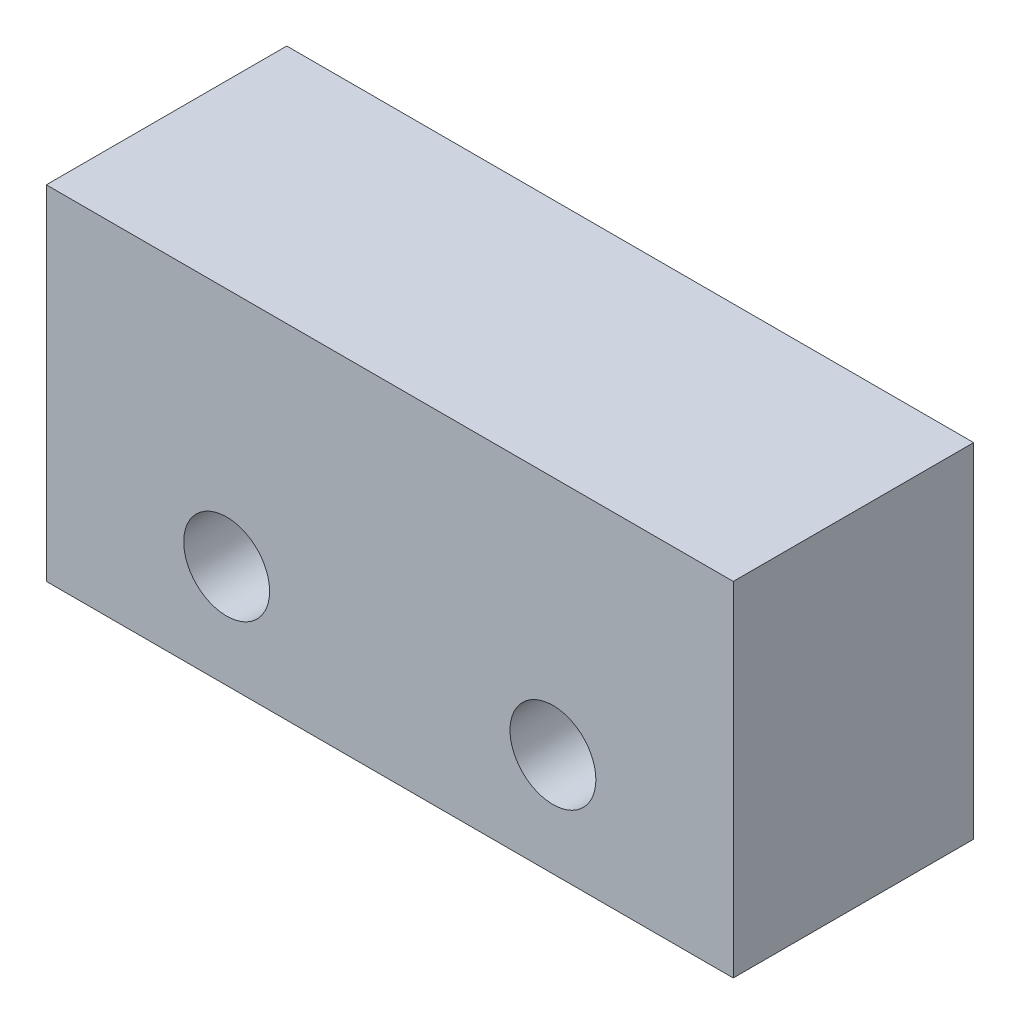
ISO-10303-21;
HEADER;
FILE_DESCRIPTION(('STEP AP214'),'2;1');
FILE_NAME('part.step','',(''),(''),'','','');
FILE_SCHEMA(('AUTOMOTIVE_DESIGN { 1 0 10303 214 1 1 1 1 }'));
ENDSEC;
DATA;
#1=APPLICATION_CONTEXT('core data for automotive mechanical design processes');
#2=APPLICATION_PROTOCOL_DEFINITION('international standard','automotive_design',2000,#1);
#3=PRODUCT_CONTEXT('',#1,'mechanical');
#4=PRODUCT('Part','Part','',(#3));
#5=PRODUCT_RELATED_PRODUCT_CATEGORY('part','',(#4));
#6=PRODUCT_DEFINITION_FORMATION('','',#4);
#7=PRODUCT_DEFINITION_CONTEXT('part definition',#1,'design');
#8=PRODUCT_DEFINITION('design','',#6,#7);
#9=PRODUCT_DEFINITION_SHAPE('','',#8);
#10=(LENGTH_UNIT() NAMED_UNIT(*) SI_UNIT(.MILLI.,.METRE.));
#11=(NAMED_UNIT(*) PLANE_ANGLE_UNIT() SI_UNIT($,.RADIAN.));
#12=(NAMED_UNIT(*) SI_UNIT($,.STERADIAN.) SOLID_ANGLE_UNIT());
#13=UNCERTAINTY_MEASURE_WITH_UNIT(LENGTH_MEASURE(1.E-05),#10,'distance_accuracy_value','');
#14=(GEOMETRIC_REPRESENTATION_CONTEXT(3) GLOBAL_UNCERTAINTY_ASSIGNED_CONTEXT((#13)) GLOBAL_UNIT_ASSIGNED_CONTEXT((#10,
#11,#12)) REPRESENTATION_CONTEXT('',''));
#15=CARTESIAN_POINT('',(0.,0.,0.));
#16=DIRECTION('',(0.,0.,1.));
#17=DIRECTION('',(1.,0.,0.));
#18=AXIS2_PLACEMENT_3D('',#15,#16,#17);
#19=CARTESIAN_POINT('',(10.,10.,-3.5));
#20=DIRECTION('',(-1.,0.,0.));
#21=DIRECTION('',(0.,0.,1.));
#22=AXIS2_PLACEMENT_3D('',#19,#20,#21);
#23=PLANE('',#22);
#24=DIRECTION('',(0.,0.,-1.));
#25=VECTOR('',#24,1.);
#26=CARTESIAN_POINT('',(10.,0.,-3.5));
#27=LINE('',#26,#25);
#28=CARTESIAN_POINT('',(10.,0.,3.5));
#29=VERTEX_POINT('',#28);
#30=CARTESIAN_POINT('',(10.,0.,-3.5));
#31=VERTEX_POINT('',#30);
#32=EDGE_CURVE('E105',#29,#31,#27,.T.);
#33=ORIENTED_EDGE('',*,*,#32,.T.);
#34=DIRECTION('',(0.,-1.,0.));
#35=VECTOR('',#34,1.);
#36=CARTESIAN_POINT('',(10.,10.,-3.5));
#37=LINE('',#36,#35);
#38=CARTESIAN_POINT('',(10.,10.,-3.5));
#39=VERTEX_POINT('',#38);
#40=EDGE_CURVE('E11',#39,#31,#37,.T.);
#41=ORIENTED_EDGE('',*,*,#40,.F.);
#42=DIRECTION('',(0.,0.,-1.));
#43=VECTOR('',#42,1.);
#44=CARTESIAN_POINT('',(10.,10.,-3.5));
#45=LINE('',#44,#43);
#46=CARTESIAN_POINT('',(10.,10.,3.5));
#47=VERTEX_POINT('',#46);
#48=EDGE_CURVE('E89',#47,#39,#45,.T.);
#49=ORIENTED_EDGE('',*,*,#48,.F.);
#50=DIRECTION('',(0.,-1.,0.));
#51=VECTOR('',#50,1.);
#52=CARTESIAN_POINT('',(10.,10.,3.5));
#53=LINE('',#52,#51);
#54=EDGE_CURVE('E101',#47,#29,#53,.T.);
#55=ORIENTED_EDGE('',*,*,#54,.T.);
#56=EDGE_LOOP('',(#33,#41,#49,#55));
#57=FACE_BOUND('',#56,.T.);
#58=ADVANCED_FACE('F37',(#57),#23,.F.);
#59=CARTESIAN_POINT('',(-10.,10.,-3.5));
#60=DIRECTION('',(0.,0.,1.));
#61=DIRECTION('',(1.,0.,0.));
#62=AXIS2_PLACEMENT_3D('',#59,#60,#61);
#63=PLANE('',#62);
#64=CARTESIAN_POINT('',(-4.75,3.,-3.5));
#65=DIRECTION('',(0.,0.,1.));
#66=DIRECTION('',(1.,0.,0.));
#67=AXIS2_PLACEMENT_3D('',#64,#65,#66);
#68=CIRCLE('',#67,1.25000000000001);
#69=CARTESIAN_POINT('',(-3.49999999999999,3.,-3.5));
#70=VERTEX_POINT('',#69);
#71=EDGE_CURVE('E133',#70,#70,#68,.T.);
#72=ORIENTED_EDGE('',*,*,#71,.T.);
#73=EDGE_LOOP('',(#72));
#74=FACE_BOUND('',#73,.T.);
#75=CARTESIAN_POINT('',(4.75,3.,-3.5));
#76=DIRECTION('',(0.,0.,1.));
#77=DIRECTION('',(1.,0.,0.));
#78=AXIS2_PLACEMENT_3D('',#75,#76,#77);
#79=CIRCLE('',#78,1.25000000000001);
#80=CARTESIAN_POINT('',(6.00000000000001,3.,-3.5));
#81=VERTEX_POINT('',#80);
#82=EDGE_CURVE('E109',#81,#81,#79,.T.);
#83=ORIENTED_EDGE('',*,*,#82,.T.);
#84=EDGE_LOOP('',(#83));
#85=FACE_BOUND('',#84,.T.);
#86=DIRECTION('',(-1.,0.,0.));
#87=VECTOR('',#86,1.);
#88=CARTESIAN_POINT('',(-10.,0.,-3.5));
#89=LINE('',#88,#87);
#90=CARTESIAN_POINT('',(-10.,0.,-3.5));
#91=VERTEX_POINT('',#90);
#92=EDGE_CURVE('E94',#31,#91,#89,.T.);
#93=ORIENTED_EDGE('',*,*,#92,.T.);
#94=DIRECTION('',(0.,-1.,0.));
#95=VECTOR('',#94,1.);
#96=CARTESIAN_POINT('',(-10.,10.,-3.5));
#97=LINE('',#96,#95);
#98=CARTESIAN_POINT('',(-10.,10.,-3.5));
#99=VERTEX_POINT('',#98);
#100=EDGE_CURVE('E46',#99,#91,#97,.T.);
#101=ORIENTED_EDGE('',*,*,#100,.F.);
#102=DIRECTION('',(-1.,0.,0.));
#103=VECTOR('',#102,1.);
#104=CARTESIAN_POINT('',(-10.,10.,-3.5));
#105=LINE('',#104,#103);
#106=EDGE_CURVE('E84',#39,#99,#105,.T.);
#107=ORIENTED_EDGE('',*,*,#106,.F.);
#108=ORIENTED_EDGE('',*,*,#40,.T.);
#109=EDGE_LOOP('',(#93,#101,#107,#108));
#110=FACE_BOUND('',#109,.T.);
#111=ADVANCED_FACE('F93',(#74,#85,#110),#63,.F.);
#112=CARTESIAN_POINT('',(-10.,10.,-3.5));
#113=DIRECTION('',(1.,0.,0.));
#114=DIRECTION('',(0.,0.,-1.));
#115=AXIS2_PLACEMENT_3D('',#112,#113,#114);
#116=PLANE('',#115);
#117=DIRECTION('',(0.,0.,1.));
#118=VECTOR('',#117,1.);
#119=CARTESIAN_POINT('',(-10.,0.,-3.5));
#120=LINE('',#119,#118);
#121=CARTESIAN_POINT('',(-10.,0.,3.5));
#122=VERTEX_POINT('',#121);
#123=EDGE_CURVE('E71',#91,#122,#120,.T.);
#124=ORIENTED_EDGE('',*,*,#123,.T.);
#125=DIRECTION('',(0.,-1.,0.));
#126=VECTOR('',#125,1.);
#127=CARTESIAN_POINT('',(-10.,10.,3.5));
#128=LINE('',#127,#126);
#129=CARTESIAN_POINT('',(-10.,10.,3.5));
#130=VERTEX_POINT('',#129);
#131=EDGE_CURVE('E96',#130,#122,#128,.T.);
#132=ORIENTED_EDGE('',*,*,#131,.F.);
#133=DIRECTION('',(0.,0.,1.));
#134=VECTOR('',#133,1.);
#135=CARTESIAN_POINT('',(-10.,10.,-3.5));
#136=LINE('',#135,#134);
#137=EDGE_CURVE('E87',#99,#130,#136,.T.);
#138=ORIENTED_EDGE('',*,*,#137,.F.);
#139=ORIENTED_EDGE('',*,*,#100,.T.);
#140=EDGE_LOOP('',(#124,#132,#138,#139));
#141=FACE_BOUND('',#140,.T.);
#142=ADVANCED_FACE('F97',(#141),#116,.F.);
#143=CARTESIAN_POINT('',(-10.,10.,3.5));
#144=DIRECTION('',(0.,0.,-1.));
#145=DIRECTION('',(-1.,0.,0.));
#146=AXIS2_PLACEMENT_3D('',#143,#144,#145);
#147=PLANE('',#146);
#148=CARTESIAN_POINT('',(-4.75,3.,3.5));
#149=DIRECTION('',(0.,0.,1.));
#150=DIRECTION('',(1.,0.,0.));
#151=AXIS2_PLACEMENT_3D('',#148,#149,#150);
#152=CIRCLE('',#151,1.25000000000001);
#153=CARTESIAN_POINT('',(-3.49999999999999,3.,3.5));
#154=VERTEX_POINT('',#153);
#155=EDGE_CURVE('E137',#154,#154,#152,.T.);
#156=ORIENTED_EDGE('',*,*,#155,.F.);
#157=EDGE_LOOP('',(#156));
#158=FACE_BOUND('',#157,.T.);
#159=CARTESIAN_POINT('',(4.75,3.,3.5));
#160=DIRECTION('',(0.,0.,1.));
#161=DIRECTION('',(1.,0.,0.));
#162=AXIS2_PLACEMENT_3D('',#159,#160,#161);
#163=CIRCLE('',#162,1.25000000000001);
#164=CARTESIAN_POINT('',(6.00000000000001,3.,3.5));
#165=VERTEX_POINT('',#164);
#166=EDGE_CURVE('E129',#165,#165,#163,.T.);
#167=ORIENTED_EDGE('',*,*,#166,.F.);
#168=EDGE_LOOP('',(#167));
#169=FACE_BOUND('',#168,.T.);
#170=DIRECTION('',(1.,0.,0.));
#171=VECTOR('',#170,1.);
#172=CARTESIAN_POINT('',(-10.,0.,3.5));
#173=LINE('',#172,#171);
#174=EDGE_CURVE('E77',#122,#29,#173,.T.);
#175=ORIENTED_EDGE('',*,*,#174,.T.);
#176=ORIENTED_EDGE('',*,*,#54,.F.);
#177=DIRECTION('',(1.,0.,0.));
#178=VECTOR('',#177,1.);
#179=CARTESIAN_POINT('',(-10.,10.,3.5));
#180=LINE('',#179,#178);
#181=EDGE_CURVE('E54',#130,#47,#180,.T.);
#182=ORIENTED_EDGE('',*,*,#181,.F.);
#183=ORIENTED_EDGE('',*,*,#131,.T.);
#184=EDGE_LOOP('',(#175,#176,#182,#183));
#185=FACE_BOUND('',#184,.T.);
#186=ADVANCED_FACE('F119',(#158,#169,#185),#147,.F.);
#187=CARTESIAN_POINT('',(0.,10.,0.));
#188=DIRECTION('',(0.,1.,0.));
#189=DIRECTION('',(0.,0.,1.));
#190=AXIS2_PLACEMENT_3D('',#187,#188,#189);
#191=PLANE('',#190);
#192=ORIENTED_EDGE('',*,*,#48,.T.);
#193=ORIENTED_EDGE('',*,*,#106,.T.);
#194=ORIENTED_EDGE('',*,*,#137,.T.);
#195=ORIENTED_EDGE('',*,*,#181,.T.);
#196=EDGE_LOOP('',(#192,#193,#194,#195));
#197=FACE_BOUND('',#196,.T.);
#198=ADVANCED_FACE('F85',(#197),#191,.T.);
#199=CARTESIAN_POINT('',(0.,0.,0.));
#200=DIRECTION('',(0.,1.,0.));
#201=DIRECTION('',(0.,0.,1.));
#202=AXIS2_PLACEMENT_3D('',#199,#200,#201);
#203=PLANE('',#202);
#204=ORIENTED_EDGE('',*,*,#32,.F.);
#205=ORIENTED_EDGE('',*,*,#174,.F.);
#206=ORIENTED_EDGE('',*,*,#123,.F.);
#207=ORIENTED_EDGE('',*,*,#92,.F.);
#208=EDGE_LOOP('',(#204,#205,#206,#207));
#209=FACE_BOUND('',#208,.T.);
#210=ADVANCED_FACE('F122',(#209),#203,.F.);
#211=CARTESIAN_POINT('',(4.75,3.,3.5));
#212=DIRECTION('',(0.,0.,1.));
#213=DIRECTION('',(1.,0.,0.));
#214=AXIS2_PLACEMENT_3D('',#211,#212,#213);
#215=CYLINDRICAL_SURFACE('',#214,1.25000000000001);
#216=ORIENTED_EDGE('',*,*,#82,.F.);
#217=EDGE_LOOP('',(#216));
#218=FACE_BOUND('',#217,.T.);
#219=ORIENTED_EDGE('',*,*,#166,.T.);
#220=EDGE_LOOP('',(#219));
#221=FACE_BOUND('',#220,.T.);
#222=ADVANCED_FACE('F149',(#218,#221),#215,.F.);
#223=CARTESIAN_POINT('',(-4.75,3.,3.5));
#224=DIRECTION('',(0.,0.,1.));
#225=DIRECTION('',(1.,0.,0.));
#226=AXIS2_PLACEMENT_3D('',#223,#224,#225);
#227=CYLINDRICAL_SURFACE('',#226,1.25000000000001);
#228=ORIENTED_EDGE('',*,*,#71,.F.);
#229=EDGE_LOOP('',(#228));
#230=FACE_BOUND('',#229,.T.);
#231=ORIENTED_EDGE('',*,*,#155,.T.);
#232=EDGE_LOOP('',(#231));
#233=FACE_BOUND('',#232,.T.);
#234=ADVANCED_FACE('F142',(#230,#233),#227,.F.);
#235=CLOSED_SHELL('',(#58,#111,#142,#186,#198,#210,#222,#234));
#236=MANIFOLD_SOLID_BREP('B2',#235);
#237=ADVANCED_BREP_SHAPE_REPRESENTATION('',(#18,#236),#14);
#238=SHAPE_DEFINITION_REPRESENTATION(#9,#237);
ENDSEC;
END-ISO-10303-21;
